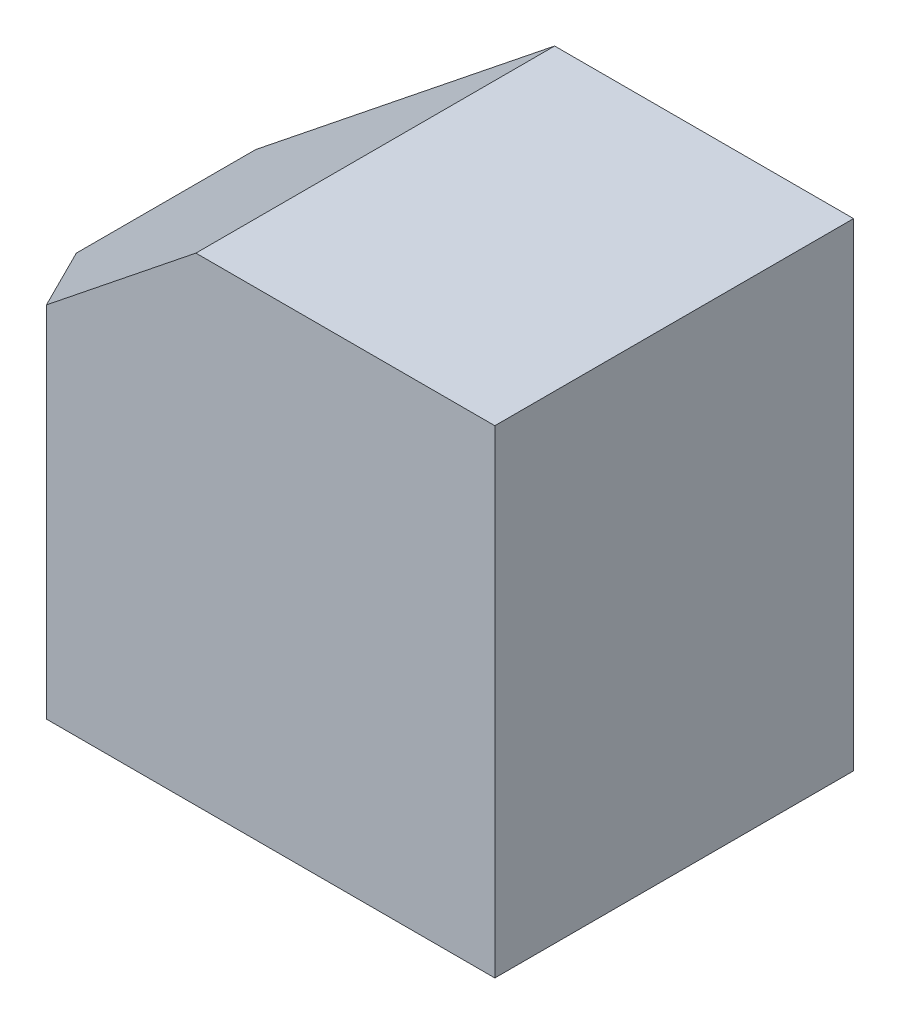
ISO-10303-21;
HEADER;
FILE_DESCRIPTION(('STEP AP214'),'2;1');
FILE_NAME('part.step','',(''),(''),'','','');
FILE_SCHEMA(('AUTOMOTIVE_DESIGN { 1 0 10303 214 1 1 1 1 }'));
ENDSEC;
DATA;
#1=APPLICATION_CONTEXT('core data for automotive mechanical design processes');
#2=APPLICATION_PROTOCOL_DEFINITION('international standard','automotive_design',2000,#1);
#3=PRODUCT_CONTEXT('',#1,'mechanical');
#4=PRODUCT('Part','Part','',(#3));
#5=PRODUCT_RELATED_PRODUCT_CATEGORY('part','',(#4));
#6=PRODUCT_DEFINITION_FORMATION('','',#4);
#7=PRODUCT_DEFINITION_CONTEXT('part definition',#1,'design');
#8=PRODUCT_DEFINITION('design','',#6,#7);
#9=PRODUCT_DEFINITION_SHAPE('','',#8);
#10=(LENGTH_UNIT() NAMED_UNIT(*) SI_UNIT(.MILLI.,.METRE.));
#11=(NAMED_UNIT(*) PLANE_ANGLE_UNIT() SI_UNIT($,.RADIAN.));
#12=(NAMED_UNIT(*) SI_UNIT($,.STERADIAN.) SOLID_ANGLE_UNIT());
#13=UNCERTAINTY_MEASURE_WITH_UNIT(LENGTH_MEASURE(1.E-05),#10,'distance_accuracy_value','');
#14=(GEOMETRIC_REPRESENTATION_CONTEXT(3) GLOBAL_UNCERTAINTY_ASSIGNED_CONTEXT((#13)) GLOBAL_UNIT_ASSIGNED_CONTEXT((#10,
#11,#12)) REPRESENTATION_CONTEXT('',''));
#15=CARTESIAN_POINT('',(0.,0.,0.));
#16=DIRECTION('',(0.,0.,1.));
#17=DIRECTION('',(1.,0.,0.));
#18=AXIS2_PLACEMENT_3D('',#15,#16,#17);
#19=CARTESIAN_POINT('',(-19.5121951219512,24.390243902439,0.));
#20=DIRECTION('',(0.624695047554424,-0.78086880944303,0.));
#21=DIRECTION('',(0.78086880944303,0.624695047554424,0.));
#22=AXIS2_PLACEMENT_3D('',#19,#20,#21);
#23=PLANE('',#22);
#24=DIRECTION('',(0.,0.,-1.));
#25=VECTOR('',#24,1.);
#26=CARTESIAN_POINT('',(0.,40.,30.));
#27=LINE('',#26,#25);
#28=CARTESIAN_POINT('',(0.,40.,30.));
#29=VERTEX_POINT('',#28);
#30=CARTESIAN_POINT('',(0.,40.,0.));
#31=VERTEX_POINT('',#30);
#32=EDGE_CURVE('E218',#29,#31,#27,.T.);
#33=ORIENTED_EDGE('',*,*,#32,.F.);
#34=DIRECTION('',(-0.56980288229819,-0.455842305838552,-0.683763458757828));
#35=VECTOR('',#34,1.);
#36=CARTESIAN_POINT('',(25.,60.,60.));
#37=LINE('',#36,#35);
#38=CARTESIAN_POINT('',(25.,60.,60.));
#39=VERTEX_POINT('',#38);
#40=EDGE_CURVE('E12',#39,#29,#37,.T.);
#41=ORIENTED_EDGE('',*,*,#40,.F.);
#42=DIRECTION('',(-0.78086880944303,-0.624695047554424,0.));
#43=VECTOR('',#42,1.);
#44=CARTESIAN_POINT('',(50.,80.,60.));
#45=LINE('',#44,#43);
#46=CARTESIAN_POINT('',(50.,80.,60.));
#47=VERTEX_POINT('',#46);
#48=EDGE_CURVE('E74',#47,#39,#45,.T.);
#49=ORIENTED_EDGE('',*,*,#48,.F.);
#50=DIRECTION('',(0.,0.,1.));
#51=VECTOR('',#50,1.);
#52=CARTESIAN_POINT('',(50.,80.,0.));
#53=LINE('',#52,#51);
#54=CARTESIAN_POINT('',(50.,80.,0.));
#55=VERTEX_POINT('',#54);
#56=EDGE_CURVE('E238',#55,#47,#53,.T.);
#57=ORIENTED_EDGE('',*,*,#56,.F.);
#58=DIRECTION('',(0.78086880944303,0.624695047554424,0.));
#59=VECTOR('',#58,1.);
#60=CARTESIAN_POINT('',(0.,40.,0.));
#61=LINE('',#60,#59);
#62=EDGE_CURVE('E242',#31,#55,#61,.T.);
#63=ORIENTED_EDGE('',*,*,#62,.F.);
#64=EDGE_LOOP('',(#33,#41,#49,#57,#63));
#65=FACE_BOUND('',#64,.T.);
#66=ADVANCED_FACE('F63',(#65),#23,.F.);
#67=CARTESIAN_POINT('',(0.,0.,0.));
#68=DIRECTION('',(0.,-1.,0.));
#69=DIRECTION('',(0.,0.,-1.));
#70=AXIS2_PLACEMENT_3D('',#67,#68,#69);
#71=PLANE('',#70);
#72=DIRECTION('',(0.,0.,-1.));
#73=VECTOR('',#72,1.);
#74=CARTESIAN_POINT('',(0.,0.,30.));
#75=LINE('',#74,#73);
#76=CARTESIAN_POINT('',(0.,0.,30.));
#77=VERTEX_POINT('',#76);
#78=CARTESIAN_POINT('',(0.,0.,0.));
#79=VERTEX_POINT('',#78);
#80=EDGE_CURVE('E314',#77,#79,#75,.T.);
#81=ORIENTED_EDGE('',*,*,#80,.T.);
#82=DIRECTION('',(1.,0.,0.));
#83=VECTOR('',#82,1.);
#84=CARTESIAN_POINT('',(0.,0.,0.));
#85=LINE('',#84,#83);
#86=CARTESIAN_POINT('',(50.,0.,0.));
#87=VERTEX_POINT('',#86);
#88=EDGE_CURVE('E303',#79,#87,#85,.T.);
#89=ORIENTED_EDGE('',*,*,#88,.T.);
#90=DIRECTION('',(1.,0.,0.));
#91=VECTOR('',#90,1.);
#92=CARTESIAN_POINT('',(50.,0.,0.));
#93=LINE('',#92,#91);
#94=CARTESIAN_POINT('',(100.,0.,0.));
#95=VERTEX_POINT('',#94);
#96=EDGE_CURVE('E161',#87,#95,#93,.T.);
#97=ORIENTED_EDGE('',*,*,#96,.T.);
#98=DIRECTION('',(0.,0.,1.));
#99=VECTOR('',#98,1.);
#100=CARTESIAN_POINT('',(100.,0.,0.));
#101=LINE('',#100,#99);
#102=CARTESIAN_POINT('',(100.,0.,60.));
#103=VERTEX_POINT('',#102);
#104=EDGE_CURVE('E135',#95,#103,#101,.T.);
#105=ORIENTED_EDGE('',*,*,#104,.T.);
#106=DIRECTION('',(-1.,0.,0.));
#107=VECTOR('',#106,1.);
#108=CARTESIAN_POINT('',(100.,0.,60.));
#109=LINE('',#108,#107);
#110=CARTESIAN_POINT('',(50.,0.,60.));
#111=VERTEX_POINT('',#110);
#112=EDGE_CURVE('E143',#103,#111,#109,.T.);
#113=ORIENTED_EDGE('',*,*,#112,.T.);
#114=DIRECTION('',(-1.,0.,0.));
#115=VECTOR('',#114,1.);
#116=CARTESIAN_POINT('',(50.,0.,60.));
#117=LINE('',#116,#115);
#118=CARTESIAN_POINT('',(25.,0.,60.));
#119=VERTEX_POINT('',#118);
#120=EDGE_CURVE('E149',#111,#119,#117,.T.);
#121=ORIENTED_EDGE('',*,*,#120,.T.);
#122=DIRECTION('',(-0.64018439966448,0.,-0.768221279597376));
#123=VECTOR('',#122,1.);
#124=CARTESIAN_POINT('',(25.,0.,60.));
#125=LINE('',#124,#123);
#126=EDGE_CURVE('E258',#119,#77,#125,.T.);
#127=ORIENTED_EDGE('',*,*,#126,.T.);
#128=EDGE_LOOP('',(#81,#89,#97,#105,#113,#121,#127));
#129=FACE_BOUND('',#128,.T.);
#130=ADVANCED_FACE('F159',(#129),#71,.T.);
#131=CARTESIAN_POINT('',(0.,0.,0.));
#132=DIRECTION('',(-1.,0.,0.));
#133=DIRECTION('',(0.,0.,1.));
#134=AXIS2_PLACEMENT_3D('',#131,#132,#133);
#135=PLANE('',#134);
#136=CARTESIAN_POINT('',(0.,0.,30.));
#137=DIRECTION('',(0.,1.,0.));
#138=VECTOR('',#137,1.);
#139=LINE('',#136,#138);
#140=EDGE_CURVE('E82',#77,#29,#139,.T.);
#141=ORIENTED_EDGE('',*,*,#140,.T.);
#142=ORIENTED_EDGE('',*,*,#32,.T.);
#143=CARTESIAN_POINT('',(0.,0.,0.));
#144=DIRECTION('',(0.,1.,0.));
#145=VECTOR('',#144,1.);
#146=LINE('',#143,#145);
#147=EDGE_CURVE('E260',#79,#31,#146,.T.);
#148=ORIENTED_EDGE('',*,*,#147,.F.);
#149=ORIENTED_EDGE('',*,*,#80,.F.);
#150=EDGE_LOOP('',(#141,#142,#148,#149));
#151=FACE_BOUND('',#150,.T.);
#152=ADVANCED_FACE('F181',(#151),#135,.T.);
#153=CARTESIAN_POINT('',(0.,0.,0.));
#154=DIRECTION('',(0.,0.,-1.));
#155=DIRECTION('',(-1.,0.,0.));
#156=AXIS2_PLACEMENT_3D('',#153,#154,#155);
#157=PLANE('',#156);
#158=ORIENTED_EDGE('',*,*,#147,.T.);
#159=ORIENTED_EDGE('',*,*,#62,.T.);
#160=DIRECTION('',(1.,0.,0.));
#161=VECTOR('',#160,1.);
#162=CARTESIAN_POINT('',(50.,80.,0.));
#163=LINE('',#162,#161);
#164=CARTESIAN_POINT('',(100.,80.,0.));
#165=VERTEX_POINT('',#164);
#166=EDGE_CURVE('E377',#55,#165,#163,.T.);
#167=ORIENTED_EDGE('',*,*,#166,.T.);
#168=CARTESIAN_POINT('',(100.,0.,0.));
#169=DIRECTION('',(0.,1.,0.));
#170=VECTOR('',#169,1.);
#171=LINE('',#168,#170);
#172=EDGE_CURVE('E142',#95,#165,#171,.T.);
#173=ORIENTED_EDGE('',*,*,#172,.F.);
#174=ORIENTED_EDGE('',*,*,#96,.F.);
#175=ORIENTED_EDGE('',*,*,#88,.F.);
#176=EDGE_LOOP('',(#158,#159,#167,#173,#174,#175));
#177=FACE_BOUND('',#176,.T.);
#178=ADVANCED_FACE('F277',(#177),#157,.T.);
#179=CARTESIAN_POINT('',(-14.7540983606557,0.,12.2950819672131));
#180=DIRECTION('',(-0.768221279597376,0.,0.64018439966448));
#181=DIRECTION('',(0.64018439966448,0.,0.768221279597376));
#182=AXIS2_PLACEMENT_3D('',#179,#180,#181);
#183=PLANE('',#182);
#184=CARTESIAN_POINT('',(25.,0.,60.));
#185=DIRECTION('',(0.,1.,0.));
#186=VECTOR('',#185,1.);
#187=LINE('',#184,#186);
#188=EDGE_CURVE('E248',#119,#39,#187,.T.);
#189=ORIENTED_EDGE('',*,*,#188,.T.);
#190=ORIENTED_EDGE('',*,*,#40,.T.);
#191=ORIENTED_EDGE('',*,*,#140,.F.);
#192=ORIENTED_EDGE('',*,*,#126,.F.);
#193=EDGE_LOOP('',(#189,#190,#191,#192));
#194=FACE_BOUND('',#193,.T.);
#195=ADVANCED_FACE('F256',(#194),#183,.T.);
#196=CARTESIAN_POINT('',(0.,0.,60.));
#197=DIRECTION('',(0.,0.,1.));
#198=DIRECTION('',(1.,0.,0.));
#199=AXIS2_PLACEMENT_3D('',#196,#197,#198);
#200=PLANE('',#199);
#201=ORIENTED_EDGE('',*,*,#120,.F.);
#202=ORIENTED_EDGE('',*,*,#112,.F.);
#203=CARTESIAN_POINT('',(100.,0.,60.));
#204=DIRECTION('',(0.,1.,0.));
#205=VECTOR('',#204,1.);
#206=LINE('',#203,#205);
#207=CARTESIAN_POINT('',(100.,80.,60.));
#208=VERTEX_POINT('',#207);
#209=EDGE_CURVE('E129',#103,#208,#206,.T.);
#210=ORIENTED_EDGE('',*,*,#209,.T.);
#211=DIRECTION('',(-1.,0.,0.));
#212=VECTOR('',#211,1.);
#213=CARTESIAN_POINT('',(100.,80.,60.));
#214=LINE('',#213,#212);
#215=EDGE_CURVE('E243',#208,#47,#214,.T.);
#216=ORIENTED_EDGE('',*,*,#215,.T.);
#217=ORIENTED_EDGE('',*,*,#48,.T.);
#218=ORIENTED_EDGE('',*,*,#188,.F.);
#219=EDGE_LOOP('',(#201,#202,#210,#216,#217,#218));
#220=FACE_BOUND('',#219,.T.);
#221=ADVANCED_FACE('F147',(#220),#200,.T.);
#222=CARTESIAN_POINT('',(0.,80.,0.));
#223=DIRECTION('',(0.,-1.,0.));
#224=DIRECTION('',(0.,0.,-1.));
#225=AXIS2_PLACEMENT_3D('',#222,#223,#224);
#226=PLANE('',#225);
#227=ORIENTED_EDGE('',*,*,#56,.T.);
#228=ORIENTED_EDGE('',*,*,#215,.F.);
#229=DIRECTION('',(0.,0.,1.));
#230=VECTOR('',#229,1.);
#231=CARTESIAN_POINT('',(100.,80.,0.));
#232=LINE('',#231,#230);
#233=EDGE_CURVE('E138',#165,#208,#232,.T.);
#234=ORIENTED_EDGE('',*,*,#233,.F.);
#235=ORIENTED_EDGE('',*,*,#166,.F.);
#236=EDGE_LOOP('',(#227,#228,#234,#235));
#237=FACE_BOUND('',#236,.T.);
#238=ADVANCED_FACE('F182',(#237),#226,.F.);
#239=CARTESIAN_POINT('',(100.,0.,0.));
#240=DIRECTION('',(1.,0.,0.));
#241=DIRECTION('',(0.,0.,-1.));
#242=AXIS2_PLACEMENT_3D('',#239,#240,#241);
#243=PLANE('',#242);
#244=ORIENTED_EDGE('',*,*,#172,.T.);
#245=ORIENTED_EDGE('',*,*,#233,.T.);
#246=ORIENTED_EDGE('',*,*,#209,.F.);
#247=ORIENTED_EDGE('',*,*,#104,.F.);
#248=EDGE_LOOP('',(#244,#245,#246,#247));
#249=FACE_BOUND('',#248,.T.);
#250=ADVANCED_FACE('F133',(#249),#243,.T.);
#251=CLOSED_SHELL('',(#66,#130,#152,#178,#195,#221,#238,#250));
#252=MANIFOLD_SOLID_BREP('B2',#251);
#253=ADVANCED_BREP_SHAPE_REPRESENTATION('',(#18,#252),#14);
#254=SHAPE_DEFINITION_REPRESENTATION(#9,#253);
ENDSEC;
END-ISO-10303-21;
